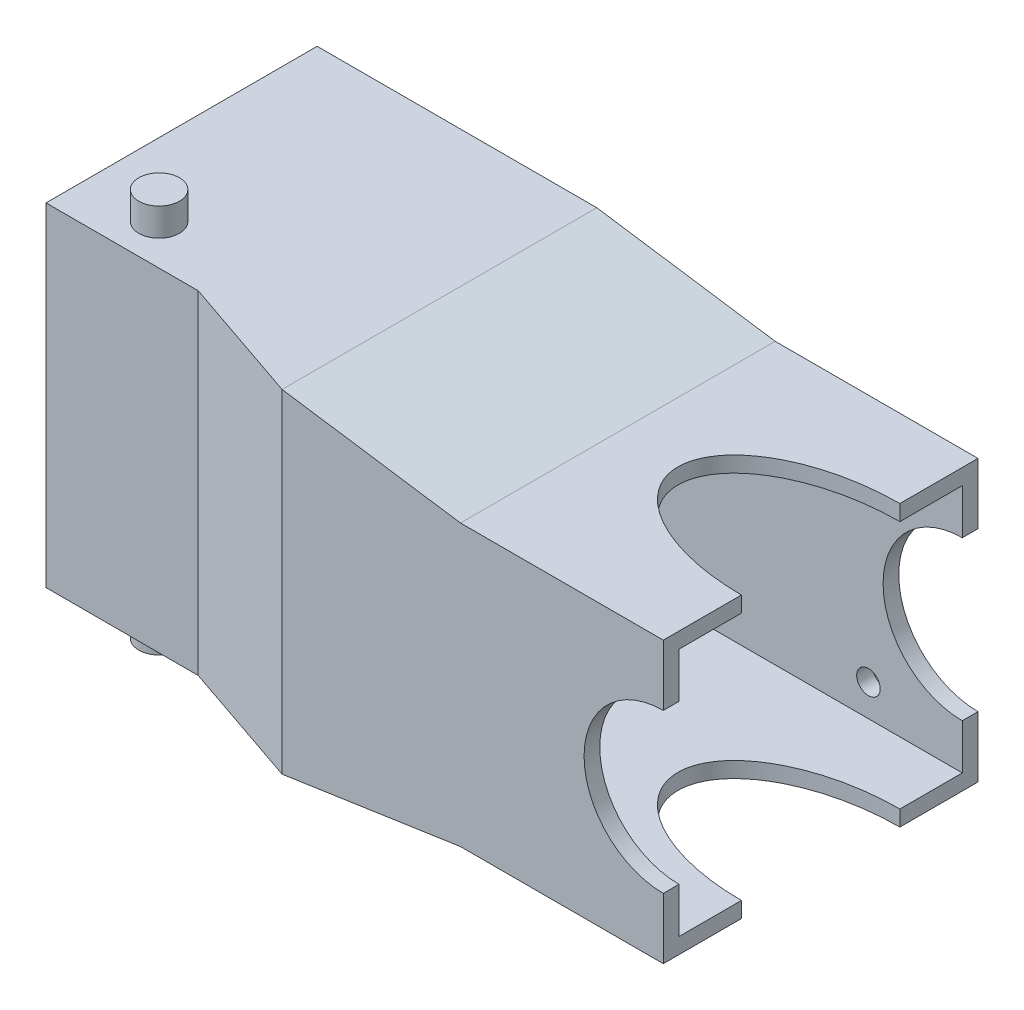
ISO-10303-21;
HEADER;
FILE_DESCRIPTION(('STEP AP214'),'2;1');
FILE_NAME('part.step','',(''),(''),'','','');
FILE_SCHEMA(('AUTOMOTIVE_DESIGN { 1 0 10303 214 1 1 1 1 }'));
ENDSEC;
DATA;
#1=APPLICATION_CONTEXT('core data for automotive mechanical design processes');
#2=APPLICATION_PROTOCOL_DEFINITION('international standard','automotive_design',2000,#1);
#3=PRODUCT_CONTEXT('',#1,'mechanical');
#4=PRODUCT('Part','Part','',(#3));
#5=PRODUCT_RELATED_PRODUCT_CATEGORY('part','',(#4));
#6=PRODUCT_DEFINITION_FORMATION('','',#4);
#7=PRODUCT_DEFINITION_CONTEXT('part definition',#1,'design');
#8=PRODUCT_DEFINITION('design','',#6,#7);
#9=PRODUCT_DEFINITION_SHAPE('','',#8);
#10=(LENGTH_UNIT() NAMED_UNIT(*) SI_UNIT(.MILLI.,.METRE.));
#11=(NAMED_UNIT(*) PLANE_ANGLE_UNIT() SI_UNIT($,.RADIAN.));
#12=(NAMED_UNIT(*) SI_UNIT($,.STERADIAN.) SOLID_ANGLE_UNIT());
#13=UNCERTAINTY_MEASURE_WITH_UNIT(LENGTH_MEASURE(1.E-05),#10,'distance_accuracy_value','');
#14=(GEOMETRIC_REPRESENTATION_CONTEXT(3) GLOBAL_UNCERTAINTY_ASSIGNED_CONTEXT((#13)) GLOBAL_UNIT_ASSIGNED_CONTEXT((#10,
#11,#12)) REPRESENTATION_CONTEXT('',''));
#15=CARTESIAN_POINT('',(0.,0.,0.));
#16=DIRECTION('',(0.,0.,1.));
#17=DIRECTION('',(1.,0.,0.));
#18=AXIS2_PLACEMENT_3D('',#15,#16,#17);
#19=CARTESIAN_POINT('',(28.42,17.435,-19.85));
#20=DIRECTION('',(0.,0.,-1.));
#21=DIRECTION('',(-1.,0.,0.));
#22=AXIS2_PLACEMENT_3D('',#19,#20,#21);
#23=PLANE('',#22);
#24=CARTESIAN_POINT('',(15.27,12.985,-19.85));
#25=DIRECTION('',(0.,0.,-1.));
#26=DIRECTION('',(-1.,0.,0.));
#27=AXIS2_PLACEMENT_3D('',#24,#25,#26);
#28=CIRCLE('',#27,1.65);
#29=CARTESIAN_POINT('',(13.62,12.985,-19.85));
#30=VERTEX_POINT('',#29);
#31=EDGE_CURVE('E285',#30,#30,#28,.T.);
#32=ORIENTED_EDGE('',*,*,#31,.T.);
#33=EDGE_LOOP('',(#32));
#34=FACE_BOUND('',#33,.T.);
#35=CARTESIAN_POINT('',(15.27,-12.985,-19.85));
#36=DIRECTION('',(0.,0.,-1.));
#37=DIRECTION('',(-1.,0.,0.));
#38=AXIS2_PLACEMENT_3D('',#35,#36,#37);
#39=CIRCLE('',#38,1.65);
#40=CARTESIAN_POINT('',(13.62,-12.985,-19.85));
#41=VERTEX_POINT('',#40);
#42=EDGE_CURVE('E289',#41,#41,#39,.T.);
#43=ORIENTED_EDGE('',*,*,#42,.T.);
#44=EDGE_LOOP('',(#43));
#45=FACE_BOUND('',#44,.T.);
#46=DIRECTION('',(0.,1.,0.));
#47=VECTOR('',#46,1.);
#48=CARTESIAN_POINT('',(-14.18,17.435,-19.85));
#49=LINE('',#48,#47);
#50=CARTESIAN_POINT('',(-14.18,-17.435,-19.85));
#51=VERTEX_POINT('',#50);
#52=CARTESIAN_POINT('',(-14.18,17.435,-19.85));
#53=VERTEX_POINT('',#52);
#54=EDGE_CURVE('E440',#51,#53,#49,.T.);
#55=ORIENTED_EDGE('',*,*,#54,.F.);
#56=DIRECTION('',(-1.,0.,0.));
#57=VECTOR('',#56,1.);
#58=CARTESIAN_POINT('',(28.42,-17.435,-19.85));
#59=LINE('',#58,#57);
#60=CARTESIAN_POINT('',(28.42,-17.435,-19.85));
#61=VERTEX_POINT('',#60);
#62=EDGE_CURVE('E365',#61,#51,#59,.T.);
#63=ORIENTED_EDGE('',*,*,#62,.F.);
#64=DIRECTION('',(0.,-1.,0.));
#65=VECTOR('',#64,1.);
#66=CARTESIAN_POINT('',(28.42,17.435,-19.85));
#67=LINE('',#66,#65);
#68=CARTESIAN_POINT('',(28.42,-11.1,-19.85));
#69=VERTEX_POINT('',#68);
#70=EDGE_CURVE('E439',#69,#61,#67,.T.);
#71=ORIENTED_EDGE('',*,*,#70,.F.);
#72=CARTESIAN_POINT('',(28.42,0.,-19.85));
#73=DIRECTION('',(0.,0.,-1.));
#74=DIRECTION('',(-1.,0.,0.));
#75=AXIS2_PLACEMENT_3D('',#72,#73,#74);
#76=CIRCLE('',#75,11.1);
#77=CARTESIAN_POINT('',(28.42,11.1,-19.85));
#78=VERTEX_POINT('',#77);
#79=EDGE_CURVE('E391',#69,#78,#76,.T.);
#80=ORIENTED_EDGE('',*,*,#79,.T.);
#81=CARTESIAN_POINT('',(28.42,17.435,-19.85));
#82=VERTEX_POINT('',#81);
#83=EDGE_CURVE('E428',#82,#78,#67,.T.);
#84=ORIENTED_EDGE('',*,*,#83,.F.);
#85=DIRECTION('',(-1.,0.,0.));
#86=VECTOR('',#85,1.);
#87=CARTESIAN_POINT('',(28.42,17.435,-19.85));
#88=LINE('',#87,#86);
#89=EDGE_CURVE('E420',#82,#53,#88,.T.);
#90=ORIENTED_EDGE('',*,*,#89,.T.);
#91=EDGE_LOOP('',(#55,#63,#71,#80,#84,#90));
#92=FACE_BOUND('',#91,.T.);
#93=ADVANCED_FACE('F34',(#34,#45,#92),#23,.F.);
#94=CARTESIAN_POINT('',(28.42,-19.635,-22.05));
#95=DIRECTION('',(0.,1.,0.));
#96=DIRECTION('',(0.,0.,1.));
#97=AXIS2_PLACEMENT_3D('',#94,#95,#96);
#98=PLANE('',#97);
#99=DIRECTION('',(0.,0.,1.));
#100=VECTOR('',#99,1.);
#101=CARTESIAN_POINT('',(0.,-19.635,-22.05));
#102=LINE('',#101,#100);
#103=CARTESIAN_POINT('',(0.,-19.635,-22.05));
#104=VERTEX_POINT('',#103);
#105=CARTESIAN_POINT('',(0.,-19.635,22.05));
#106=VERTEX_POINT('',#105);
#107=EDGE_CURVE('E276',#104,#106,#102,.T.);
#108=ORIENTED_EDGE('',*,*,#107,.F.);
#109=DIRECTION('',(-1.,0.,0.));
#110=VECTOR('',#109,1.);
#111=CARTESIAN_POINT('',(28.42,-19.635,-22.05));
#112=LINE('',#111,#110);
#113=CARTESIAN_POINT('',(28.42,-19.635,-22.05));
#114=VERTEX_POINT('',#113);
#115=EDGE_CURVE('E387',#114,#104,#112,.T.);
#116=ORIENTED_EDGE('',*,*,#115,.F.);
#117=DIRECTION('',(0.,0.,-1.));
#118=VECTOR('',#117,1.);
#119=CARTESIAN_POINT('',(28.42,-19.635,-22.05));
#120=LINE('',#119,#118);
#121=CARTESIAN_POINT('',(28.42,-19.635,-11.1));
#122=VERTEX_POINT('',#121);
#123=EDGE_CURVE('E363',#122,#114,#120,.T.);
#124=ORIENTED_EDGE('',*,*,#123,.F.);
#125=CARTESIAN_POINT('',(28.42,-19.635,0.));
#126=DIRECTION('',(0.,-1.,0.));
#127=DIRECTION('',(-1.,0.,0.));
#128=AXIS2_PLACEMENT_3D('',#125,#126,#127);
#129=ELLIPSE('',#128,20.,11.1);
#130=CARTESIAN_POINT('',(28.42,-19.635,11.1));
#131=VERTEX_POINT('',#130);
#132=EDGE_CURVE('E292',#131,#122,#129,.T.);
#133=ORIENTED_EDGE('',*,*,#132,.F.);
#134=CARTESIAN_POINT('',(28.42,-19.635,22.05));
#135=VERTEX_POINT('',#134);
#136=EDGE_CURVE('E371',#135,#131,#120,.T.);
#137=ORIENTED_EDGE('',*,*,#136,.F.);
#138=DIRECTION('',(-1.,0.,0.));
#139=VECTOR('',#138,1.);
#140=CARTESIAN_POINT('',(28.42,-19.635,22.05));
#141=LINE('',#140,#139);
#142=EDGE_CURVE('E355',#135,#106,#141,.T.);
#143=ORIENTED_EDGE('',*,*,#142,.T.);
#144=EDGE_LOOP('',(#108,#116,#124,#133,#137,#143));
#145=FACE_BOUND('',#144,.T.);
#146=ADVANCED_FACE('F315',(#145),#98,.F.);
#147=CARTESIAN_POINT('',(28.42,0.,0.));
#148=DIRECTION('',(1.,0.,0.));
#149=DIRECTION('',(0.,0.,-1.));
#150=AXIS2_PLACEMENT_3D('',#147,#148,#149);
#151=PLANE('',#150);
#152=DIRECTION('',(0.,-1.,0.));
#153=VECTOR('',#152,1.);
#154=CARTESIAN_POINT('',(28.42,30.365,11.1));
#155=LINE('',#154,#153);
#156=CARTESIAN_POINT('',(28.42,19.635,11.1));
#157=VERTEX_POINT('',#156);
#158=CARTESIAN_POINT('',(28.42,17.435,11.1));
#159=VERTEX_POINT('',#158);
#160=EDGE_CURVE('E528',#157,#159,#155,.T.);
#161=ORIENTED_EDGE('',*,*,#160,.F.);
#162=DIRECTION('',(0.,0.,1.));
#163=VECTOR('',#162,1.);
#164=CARTESIAN_POINT('',(28.42,19.635,-22.05));
#165=LINE('',#164,#163);
#166=CARTESIAN_POINT('',(28.42,19.635,22.05));
#167=VERTEX_POINT('',#166);
#168=EDGE_CURVE('E377',#157,#167,#165,.T.);
#169=ORIENTED_EDGE('',*,*,#168,.T.);
#170=DIRECTION('',(0.,-1.,0.));
#171=VECTOR('',#170,1.);
#172=CARTESIAN_POINT('',(28.42,-19.635,22.05));
#173=LINE('',#172,#171);
#174=CARTESIAN_POINT('',(28.42,11.1,22.05));
#175=VERTEX_POINT('',#174);
#176=EDGE_CURVE('E360',#167,#175,#173,.T.);
#177=ORIENTED_EDGE('',*,*,#176,.T.);
#178=DIRECTION('',(0.,0.,1.));
#179=VECTOR('',#178,1.);
#180=CARTESIAN_POINT('',(28.42,11.1,-27.95));
#181=LINE('',#180,#179);
#182=CARTESIAN_POINT('',(28.42,11.1,19.85));
#183=VERTEX_POINT('',#182);
#184=EDGE_CURVE('E539',#183,#175,#181,.T.);
#185=ORIENTED_EDGE('',*,*,#184,.F.);
#186=DIRECTION('',(0.,1.,0.));
#187=VECTOR('',#186,1.);
#188=CARTESIAN_POINT('',(28.42,17.435,19.85));
#189=LINE('',#188,#187);
#190=CARTESIAN_POINT('',(28.42,17.435,19.85));
#191=VERTEX_POINT('',#190);
#192=EDGE_CURVE('E545',#183,#191,#189,.T.);
#193=ORIENTED_EDGE('',*,*,#192,.T.);
#194=DIRECTION('',(0.,0.,-1.));
#195=VECTOR('',#194,1.);
#196=CARTESIAN_POINT('',(28.42,17.435,-19.85));
#197=LINE('',#196,#195);
#198=EDGE_CURVE('E419',#191,#159,#197,.T.);
#199=ORIENTED_EDGE('',*,*,#198,.T.);
#200=EDGE_LOOP('',(#161,#169,#177,#185,#193,#199));
#201=FACE_BOUND('',#200,.T.);
#202=ADVANCED_FACE('F328',(#201),#151,.T.);
#203=DIRECTION('',(0.,-1.,0.));
#204=VECTOR('',#203,1.);
#205=CARTESIAN_POINT('',(28.42,30.365,11.1));
#206=LINE('',#205,#204);
#207=CARTESIAN_POINT('',(28.42,-17.435,11.1));
#208=VERTEX_POINT('',#207);
#209=EDGE_CURVE('E520',#208,#131,#206,.T.);
#210=ORIENTED_EDGE('',*,*,#209,.F.);
#211=DIRECTION('',(0.,0.,1.));
#212=VECTOR('',#211,1.);
#213=CARTESIAN_POINT('',(28.42,-17.435,-19.85));
#214=LINE('',#213,#212);
#215=CARTESIAN_POINT('',(28.42,-17.435,19.85));
#216=VERTEX_POINT('',#215);
#217=EDGE_CURVE('E424',#208,#216,#214,.T.);
#218=ORIENTED_EDGE('',*,*,#217,.T.);
#219=CARTESIAN_POINT('',(28.42,-11.1,19.85));
#220=VERTEX_POINT('',#219);
#221=EDGE_CURVE('E415',#216,#220,#189,.T.);
#222=ORIENTED_EDGE('',*,*,#221,.T.);
#223=DIRECTION('',(0.,0.,1.));
#224=VECTOR('',#223,1.);
#225=CARTESIAN_POINT('',(28.42,-11.1,-27.95));
#226=LINE('',#225,#224);
#227=CARTESIAN_POINT('',(28.42,-11.1,22.05));
#228=VERTEX_POINT('',#227);
#229=EDGE_CURVE('E536',#228,#220,#226,.F.);
#230=ORIENTED_EDGE('',*,*,#229,.F.);
#231=EDGE_CURVE('E350',#228,#135,#173,.T.);
#232=ORIENTED_EDGE('',*,*,#231,.T.);
#233=ORIENTED_EDGE('',*,*,#136,.T.);
#234=EDGE_LOOP('',(#210,#218,#222,#230,#232,#233));
#235=FACE_BOUND('',#234,.T.);
#236=ADVANCED_FACE('F345',(#235),#151,.T.);
#237=DIRECTION('',(0.,-1.,0.));
#238=VECTOR('',#237,1.);
#239=CARTESIAN_POINT('',(28.42,30.365,-11.1));
#240=LINE('',#239,#238);
#241=CARTESIAN_POINT('',(28.42,17.435,-11.1));
#242=VERTEX_POINT('',#241);
#243=CARTESIAN_POINT('',(28.42,19.635,-11.1));
#244=VERTEX_POINT('',#243);
#245=EDGE_CURVE('E552',#242,#244,#240,.F.);
#246=ORIENTED_EDGE('',*,*,#245,.F.);
#247=EDGE_CURVE('E544',#242,#82,#197,.T.);
#248=ORIENTED_EDGE('',*,*,#247,.T.);
#249=ORIENTED_EDGE('',*,*,#83,.T.);
#250=CARTESIAN_POINT('',(28.42,11.1,-22.05));
#251=VERTEX_POINT('',#250);
#252=EDGE_CURVE('E535',#251,#78,#181,.T.);
#253=ORIENTED_EDGE('',*,*,#252,.F.);
#254=DIRECTION('',(0.,1.,0.));
#255=VECTOR('',#254,1.);
#256=CARTESIAN_POINT('',(28.42,-19.635,-22.05));
#257=LINE('',#256,#255);
#258=CARTESIAN_POINT('',(28.42,19.635,-22.05));
#259=VERTEX_POINT('',#258);
#260=EDGE_CURVE('E373',#251,#259,#257,.T.);
#261=ORIENTED_EDGE('',*,*,#260,.T.);
#262=EDGE_CURVE('E378',#259,#244,#165,.T.);
#263=ORIENTED_EDGE('',*,*,#262,.T.);
#264=EDGE_LOOP('',(#246,#248,#249,#253,#261,#263));
#265=FACE_BOUND('',#264,.T.);
#266=ADVANCED_FACE('F329',(#265),#151,.T.);
#267=CARTESIAN_POINT('',(28.42,-19.635,22.05));
#268=DIRECTION('',(0.,0.,-1.));
#269=DIRECTION('',(-1.,0.,0.));
#270=AXIS2_PLACEMENT_3D('',#267,#268,#269);
#271=PLANE('',#270);
#272=ORIENTED_EDGE('',*,*,#231,.F.);
#273=CARTESIAN_POINT('',(28.42,0.,22.05));
#274=DIRECTION('',(0.,0.,1.));
#275=DIRECTION('',(1.,0.,0.));
#276=AXIS2_PLACEMENT_3D('',#273,#274,#275);
#277=CIRCLE('',#276,11.1);
#278=EDGE_CURVE('E352',#175,#228,#277,.T.);
#279=ORIENTED_EDGE('',*,*,#278,.F.);
#280=ORIENTED_EDGE('',*,*,#176,.F.);
#281=DIRECTION('',(-1.,0.,0.));
#282=VECTOR('',#281,1.);
#283=CARTESIAN_POINT('',(28.42,19.635,22.05));
#284=LINE('',#283,#282);
#285=CARTESIAN_POINT('',(0.,19.635,22.05));
#286=VERTEX_POINT('',#285);
#287=EDGE_CURVE('E381',#167,#286,#284,.T.);
#288=ORIENTED_EDGE('',*,*,#287,.T.);
#289=DIRECTION('',(-0.989167317751702,0.146792429954352,0.));
#290=VECTOR('',#289,1.);
#291=CARTESIAN_POINT('',(0.,19.635,22.05));
#292=LINE('',#291,#290);
#293=CARTESIAN_POINT('',(-25.,23.345,22.05));
#294=VERTEX_POINT('',#293);
#295=EDGE_CURVE('E260',#286,#294,#292,.T.);
#296=ORIENTED_EDGE('',*,*,#295,.T.);
#297=DIRECTION('',(0.,1.,0.));
#298=VECTOR('',#297,1.);
#299=CARTESIAN_POINT('',(-25.,-19.635,22.05));
#300=LINE('',#299,#298);
#301=CARTESIAN_POINT('',(-25.,-23.345,22.05));
#302=VERTEX_POINT('',#301);
#303=EDGE_CURVE('E222',#302,#294,#300,.T.);
#304=ORIENTED_EDGE('',*,*,#303,.F.);
#305=DIRECTION('',(0.989167317751702,0.146792429954352,0.));
#306=VECTOR('',#305,1.);
#307=CARTESIAN_POINT('',(0.,-19.635,22.05));
#308=LINE('',#307,#306);
#309=EDGE_CURVE('E268',#302,#106,#308,.T.);
#310=ORIENTED_EDGE('',*,*,#309,.T.);
#311=ORIENTED_EDGE('',*,*,#142,.F.);
#312=EDGE_LOOP('',(#272,#279,#280,#288,#296,#304,#310,#311));
#313=FACE_BOUND('',#312,.T.);
#314=ADVANCED_FACE('F336',(#313),#271,.F.);
#315=CARTESIAN_POINT('',(28.42,-19.635,-22.05));
#316=DIRECTION('',(0.,0.,1.));
#317=DIRECTION('',(1.,0.,0.));
#318=AXIS2_PLACEMENT_3D('',#315,#316,#317);
#319=PLANE('',#318);
#320=DIRECTION('',(0.989167317751702,0.146792429954352,0.));
#321=VECTOR('',#320,1.);
#322=CARTESIAN_POINT('',(0.,-19.635,-22.05));
#323=LINE('',#322,#321);
#324=CARTESIAN_POINT('',(-25.,-23.345,-22.05));
#325=VERTEX_POINT('',#324);
#326=EDGE_CURVE('E271',#325,#104,#323,.T.);
#327=ORIENTED_EDGE('',*,*,#326,.F.);
#328=DIRECTION('',(-1.,0.,0.));
#329=VECTOR('',#328,1.);
#330=CARTESIAN_POINT('',(-25.,-23.345,-22.05));
#331=LINE('',#330,#329);
#332=CARTESIAN_POINT('',(-64.18,-23.345,-22.05));
#333=VERTEX_POINT('',#332);
#334=EDGE_CURVE('E244',#325,#333,#331,.T.);
#335=ORIENTED_EDGE('',*,*,#334,.T.);
#336=DIRECTION('',(0.,1.,0.));
#337=VECTOR('',#336,1.);
#338=CARTESIAN_POINT('',(-64.18,19.635,-22.05));
#339=LINE('',#338,#337);
#340=CARTESIAN_POINT('',(-64.18,23.345,-22.05));
#341=VERTEX_POINT('',#340);
#342=EDGE_CURVE('E280',#333,#341,#339,.T.);
#343=ORIENTED_EDGE('',*,*,#342,.T.);
#344=DIRECTION('',(1.,0.,0.));
#345=VECTOR('',#344,1.);
#346=CARTESIAN_POINT('',(-64.18,23.345,-22.05));
#347=LINE('',#346,#345);
#348=CARTESIAN_POINT('',(-25.,23.345,-22.05));
#349=VERTEX_POINT('',#348);
#350=EDGE_CURVE('E256',#341,#349,#347,.T.);
#351=ORIENTED_EDGE('',*,*,#350,.T.);
#352=DIRECTION('',(-0.989167317751702,0.146792429954352,0.));
#353=VECTOR('',#352,1.);
#354=CARTESIAN_POINT('',(0.,19.635,-22.05));
#355=LINE('',#354,#353);
#356=CARTESIAN_POINT('',(0.,19.635,-22.05));
#357=VERTEX_POINT('',#356);
#358=EDGE_CURVE('E261',#357,#349,#355,.T.);
#359=ORIENTED_EDGE('',*,*,#358,.F.);
#360=DIRECTION('',(-1.,0.,0.));
#361=VECTOR('',#360,1.);
#362=CARTESIAN_POINT('',(28.42,19.635,-22.05));
#363=LINE('',#362,#361);
#364=EDGE_CURVE('E384',#259,#357,#363,.T.);
#365=ORIENTED_EDGE('',*,*,#364,.F.);
#366=ORIENTED_EDGE('',*,*,#260,.F.);
#367=CARTESIAN_POINT('',(28.42,0.,-22.05));
#368=DIRECTION('',(0.,0.,1.));
#369=DIRECTION('',(1.,0.,0.));
#370=AXIS2_PLACEMENT_3D('',#367,#368,#369);
#371=CIRCLE('',#370,11.1);
#372=CARTESIAN_POINT('',(28.42,-11.1,-22.05));
#373=VERTEX_POINT('',#372);
#374=EDGE_CURVE('E538',#251,#373,#371,.T.);
#375=ORIENTED_EDGE('',*,*,#374,.T.);
#376=EDGE_CURVE('E374',#114,#373,#257,.T.);
#377=ORIENTED_EDGE('',*,*,#376,.F.);
#378=ORIENTED_EDGE('',*,*,#115,.T.);
#379=EDGE_LOOP('',(#327,#335,#343,#351,#359,#365,#366,#375,#377,#378));
#380=FACE_BOUND('',#379,.T.);
#381=CARTESIAN_POINT('',(15.27,-12.985,-22.05));
#382=DIRECTION('',(0.,0.,-1.));
#383=DIRECTION('',(-1.,0.,0.));
#384=AXIS2_PLACEMENT_3D('',#381,#382,#383);
#385=CIRCLE('',#384,1.65);
#386=CARTESIAN_POINT('',(13.62,-12.985,-22.05));
#387=VERTEX_POINT('',#386);
#388=EDGE_CURVE('E286',#387,#387,#385,.T.);
#389=ORIENTED_EDGE('',*,*,#388,.F.);
#390=EDGE_LOOP('',(#389));
#391=FACE_BOUND('',#390,.T.);
#392=CARTESIAN_POINT('',(15.27,12.985,-22.05));
#393=DIRECTION('',(0.,0.,-1.));
#394=DIRECTION('',(1.,0.,0.));
#395=AXIS2_PLACEMENT_3D('',#392,#393,#394);
#396=CIRCLE('',#395,1.65);
#397=CARTESIAN_POINT('',(16.92,12.985,-22.05));
#398=VERTEX_POINT('',#397);
#399=EDGE_CURVE('E282',#398,#398,#396,.T.);
#400=ORIENTED_EDGE('',*,*,#399,.F.);
#401=EDGE_LOOP('',(#400));
#402=FACE_BOUND('',#401,.T.);
#403=ADVANCED_FACE('F332',(#380,#391,#402),#319,.F.);
#404=CARTESIAN_POINT('',(28.42,19.635,-22.05));
#405=DIRECTION('',(0.,-1.,0.));
#406=DIRECTION('',(0.,0.,-1.));
#407=AXIS2_PLACEMENT_3D('',#404,#405,#406);
#408=PLANE('',#407);
#409=ORIENTED_EDGE('',*,*,#364,.T.);
#410=DIRECTION('',(0.,0.,1.));
#411=VECTOR('',#410,1.);
#412=CARTESIAN_POINT('',(0.,19.635,-22.05));
#413=LINE('',#412,#411);
#414=EDGE_CURVE('E264',#357,#286,#413,.T.);
#415=ORIENTED_EDGE('',*,*,#414,.T.);
#416=ORIENTED_EDGE('',*,*,#287,.F.);
#417=ORIENTED_EDGE('',*,*,#168,.F.);
#418=CARTESIAN_POINT('',(28.42,19.635,0.));
#419=DIRECTION('',(0.,-1.,0.));
#420=DIRECTION('',(-1.,0.,0.));
#421=AXIS2_PLACEMENT_3D('',#418,#419,#420);
#422=ELLIPSE('',#421,20.,11.1);
#423=EDGE_CURVE('E524',#157,#244,#422,.T.);
#424=ORIENTED_EDGE('',*,*,#423,.T.);
#425=ORIENTED_EDGE('',*,*,#262,.F.);
#426=EDGE_LOOP('',(#409,#415,#416,#417,#424,#425));
#427=FACE_BOUND('',#426,.T.);
#428=ADVANCED_FACE('F326',(#427),#408,.F.);
#429=DIRECTION('',(0.,-1.,0.));
#430=VECTOR('',#429,1.);
#431=CARTESIAN_POINT('',(28.42,30.365,-11.1));
#432=LINE('',#431,#430);
#433=CARTESIAN_POINT('',(28.42,-17.435,-11.1));
#434=VERTEX_POINT('',#433);
#435=EDGE_CURVE('E521',#122,#434,#432,.F.);
#436=ORIENTED_EDGE('',*,*,#435,.F.);
#437=ORIENTED_EDGE('',*,*,#123,.T.);
#438=ORIENTED_EDGE('',*,*,#376,.T.);
#439=EDGE_CURVE('E533',#69,#373,#226,.F.);
#440=ORIENTED_EDGE('',*,*,#439,.F.);
#441=ORIENTED_EDGE('',*,*,#70,.T.);
#442=EDGE_CURVE('E421',#61,#434,#214,.T.);
#443=ORIENTED_EDGE('',*,*,#442,.T.);
#444=EDGE_LOOP('',(#436,#437,#438,#440,#441,#443));
#445=FACE_BOUND('',#444,.T.);
#446=ADVANCED_FACE('F322',(#445),#151,.T.);
#447=CARTESIAN_POINT('',(28.42,17.435,19.85));
#448=DIRECTION('',(0.,0.,1.));
#449=DIRECTION('',(1.,0.,0.));
#450=AXIS2_PLACEMENT_3D('',#447,#448,#449);
#451=PLANE('',#450);
#452=ORIENTED_EDGE('',*,*,#192,.F.);
#453=CARTESIAN_POINT('',(28.42,0.,19.85));
#454=DIRECTION('',(0.,0.,1.));
#455=DIRECTION('',(1.,0.,0.));
#456=AXIS2_PLACEMENT_3D('',#453,#454,#455);
#457=CIRCLE('',#456,11.1);
#458=EDGE_CURVE('E542',#183,#220,#457,.T.);
#459=ORIENTED_EDGE('',*,*,#458,.T.);
#460=ORIENTED_EDGE('',*,*,#221,.F.);
#461=DIRECTION('',(-1.,0.,0.));
#462=VECTOR('',#461,1.);
#463=CARTESIAN_POINT('',(28.42,-17.435,19.85));
#464=LINE('',#463,#462);
#465=CARTESIAN_POINT('',(-25.,-17.435,19.85));
#466=VERTEX_POINT('',#465);
#467=EDGE_CURVE('E361',#216,#466,#464,.T.);
#468=ORIENTED_EDGE('',*,*,#467,.T.);
#469=DIRECTION('',(0.,-1.,0.));
#470=VECTOR('',#469,1.);
#471=CARTESIAN_POINT('',(-25.,17.435,19.85));
#472=LINE('',#471,#470);
#473=CARTESIAN_POINT('',(-25.,17.435,19.85));
#474=VERTEX_POINT('',#473);
#475=EDGE_CURVE('E241',#474,#466,#472,.T.);
#476=ORIENTED_EDGE('',*,*,#475,.F.);
#477=DIRECTION('',(-1.,0.,0.));
#478=VECTOR('',#477,1.);
#479=CARTESIAN_POINT('',(28.42,17.435,19.85));
#480=LINE('',#479,#478);
#481=EDGE_CURVE('E369',#191,#474,#480,.T.);
#482=ORIENTED_EDGE('',*,*,#481,.F.);
#483=EDGE_LOOP('',(#452,#459,#460,#468,#476,#482));
#484=FACE_BOUND('',#483,.T.);
#485=ADVANCED_FACE('F312',(#484),#451,.F.);
#486=CARTESIAN_POINT('',(28.42,-17.435,-19.85));
#487=DIRECTION('',(0.,-1.,0.));
#488=DIRECTION('',(0.,0.,-1.));
#489=AXIS2_PLACEMENT_3D('',#486,#487,#488);
#490=PLANE('',#489);
#491=DIRECTION('',(0.,0.,-1.));
#492=VECTOR('',#491,1.);
#493=CARTESIAN_POINT('',(-14.18,-17.435,-19.85));
#494=LINE('',#493,#492);
#495=CARTESIAN_POINT('',(-14.18,-17.435,13.75));
#496=VERTEX_POINT('',#495);
#497=EDGE_CURVE('E434',#496,#51,#494,.T.);
#498=ORIENTED_EDGE('',*,*,#497,.F.);
#499=DIRECTION('',(-1.,0.,0.));
#500=VECTOR('',#499,1.);
#501=CARTESIAN_POINT('',(28.42,-17.435,13.75));
#502=LINE('',#501,#500);
#503=CARTESIAN_POINT('',(-48.9330315672712,-17.435,13.75));
#504=VERTEX_POINT('',#503);
#505=EDGE_CURVE('E49',#496,#504,#502,.T.);
#506=ORIENTED_EDGE('',*,*,#505,.T.);
#507=CARTESIAN_POINT('',(-48.9330315672712,-17.435,63.75));
#508=DIRECTION('',(0.,-1.,0.));
#509=DIRECTION('',(0.,0.,-1.));
#510=AXIS2_PLACEMENT_3D('',#507,#508,#509);
#511=CIRCLE('',#510,50.);
#512=EDGE_CURVE('E42',#504,#466,#511,.T.);
#513=ORIENTED_EDGE('',*,*,#512,.T.);
#514=ORIENTED_EDGE('',*,*,#467,.F.);
#515=ORIENTED_EDGE('',*,*,#217,.F.);
#516=CARTESIAN_POINT('',(28.42,-17.435,0.));
#517=DIRECTION('',(0.,-1.,0.));
#518=DIRECTION('',(-1.,0.,0.));
#519=AXIS2_PLACEMENT_3D('',#516,#517,#518);
#520=ELLIPSE('',#519,20.,11.1);
#521=EDGE_CURVE('E523',#208,#434,#520,.T.);
#522=ORIENTED_EDGE('',*,*,#521,.T.);
#523=ORIENTED_EDGE('',*,*,#442,.F.);
#524=ORIENTED_EDGE('',*,*,#62,.T.);
#525=EDGE_LOOP('',(#498,#506,#513,#514,#515,#522,#523,#524));
#526=FACE_BOUND('',#525,.T.);
#527=ADVANCED_FACE('F308',(#526),#490,.F.);
#528=CARTESIAN_POINT('',(28.42,17.435,-19.85));
#529=DIRECTION('',(0.,1.,0.));
#530=DIRECTION('',(0.,0.,1.));
#531=AXIS2_PLACEMENT_3D('',#528,#529,#530);
#532=PLANE('',#531);
#533=ORIENTED_EDGE('',*,*,#481,.T.);
#534=CARTESIAN_POINT('',(-48.9330315672712,17.435,63.75));
#535=DIRECTION('',(0.,1.,0.));
#536=DIRECTION('',(0.,0.,1.));
#537=AXIS2_PLACEMENT_3D('',#534,#535,#536);
#538=CIRCLE('',#537,50.);
#539=CARTESIAN_POINT('',(-48.9330315672712,17.435,13.75));
#540=VERTEX_POINT('',#539);
#541=EDGE_CURVE('E11',#474,#540,#538,.T.);
#542=ORIENTED_EDGE('',*,*,#541,.T.);
#543=DIRECTION('',(1.,0.,0.));
#544=VECTOR('',#543,1.);
#545=CARTESIAN_POINT('',(28.42,17.435,13.75));
#546=LINE('',#545,#544);
#547=CARTESIAN_POINT('',(-14.18,17.435,13.75));
#548=VERTEX_POINT('',#547);
#549=EDGE_CURVE('E57',#540,#548,#546,.T.);
#550=ORIENTED_EDGE('',*,*,#549,.T.);
#551=DIRECTION('',(0.,0.,1.));
#552=VECTOR('',#551,1.);
#553=CARTESIAN_POINT('',(-14.18,17.435,-19.85));
#554=LINE('',#553,#552);
#555=EDGE_CURVE('E397',#53,#548,#554,.T.);
#556=ORIENTED_EDGE('',*,*,#555,.F.);
#557=ORIENTED_EDGE('',*,*,#89,.F.);
#558=ORIENTED_EDGE('',*,*,#247,.F.);
#559=CARTESIAN_POINT('',(28.42,17.435,0.));
#560=DIRECTION('',(0.,-1.,0.));
#561=DIRECTION('',(-1.,0.,0.));
#562=AXIS2_PLACEMENT_3D('',#559,#560,#561);
#563=ELLIPSE('',#562,20.,11.1);
#564=EDGE_CURVE('E394',#242,#159,#563,.F.);
#565=ORIENTED_EDGE('',*,*,#564,.T.);
#566=ORIENTED_EDGE('',*,*,#198,.F.);
#567=EDGE_LOOP('',(#533,#542,#550,#556,#557,#558,#565,#566));
#568=FACE_BOUND('',#567,.T.);
#569=ADVANCED_FACE('F311',(#568),#532,.F.);
#570=CARTESIAN_POINT('',(28.42,0.,-27.95));
#571=DIRECTION('',(0.,0.,1.));
#572=DIRECTION('',(1.,0.,0.));
#573=AXIS2_PLACEMENT_3D('',#570,#571,#572);
#574=CYLINDRICAL_SURFACE('',#573,11.1);
#575=ORIENTED_EDGE('',*,*,#252,.T.);
#576=ORIENTED_EDGE('',*,*,#79,.F.);
#577=ORIENTED_EDGE('',*,*,#439,.T.);
#578=ORIENTED_EDGE('',*,*,#374,.F.);
#579=EDGE_LOOP('',(#575,#576,#577,#578));
#580=FACE_BOUND('',#579,.T.);
#581=ADVANCED_FACE('F306',(#580),#574,.F.);
#582=ORIENTED_EDGE('',*,*,#184,.T.);
#583=ORIENTED_EDGE('',*,*,#278,.T.);
#584=ORIENTED_EDGE('',*,*,#229,.T.);
#585=ORIENTED_EDGE('',*,*,#458,.F.);
#586=EDGE_LOOP('',(#582,#583,#584,#585));
#587=FACE_BOUND('',#586,.T.);
#588=ADVANCED_FACE('F303',(#587),#574,.F.);
#589=CARTESIAN_POINT('',(28.42,30.365,0.));
#590=DIRECTION('',(0.,-1.,0.));
#591=DIRECTION('',(-1.,0.,0.));
#592=AXIS2_PLACEMENT_3D('',#589,#590,#591);
#593=ELLIPSE('',#592,20.,11.1);
#594=DIRECTION('',(0.,-1.,0.));
#595=VECTOR('',#594,1.);
#596=SURFACE_OF_LINEAR_EXTRUSION('',#593,#595);
#597=ORIENTED_EDGE('',*,*,#160,.T.);
#598=ORIENTED_EDGE('',*,*,#564,.F.);
#599=ORIENTED_EDGE('',*,*,#245,.T.);
#600=ORIENTED_EDGE('',*,*,#423,.F.);
#601=EDGE_LOOP('',(#597,#598,#599,#600));
#602=FACE_BOUND('',#601,.T.);
#603=ADVANCED_FACE('F300',(#602),#596,.F.);
#604=ORIENTED_EDGE('',*,*,#209,.T.);
#605=ORIENTED_EDGE('',*,*,#132,.T.);
#606=ORIENTED_EDGE('',*,*,#435,.T.);
#607=ORIENTED_EDGE('',*,*,#521,.F.);
#608=EDGE_LOOP('',(#604,#605,#606,#607));
#609=FACE_BOUND('',#608,.T.);
#610=ADVANCED_FACE('F295',(#609),#596,.F.);
#611=CARTESIAN_POINT('',(15.27,-12.985,-12.05));
#612=DIRECTION('',(0.,0.,-1.));
#613=DIRECTION('',(-1.,0.,0.));
#614=AXIS2_PLACEMENT_3D('',#611,#612,#613);
#615=CYLINDRICAL_SURFACE('',#614,1.65);
#616=ORIENTED_EDGE('',*,*,#388,.T.);
#617=EDGE_LOOP('',(#616));
#618=FACE_BOUND('',#617,.T.);
#619=ORIENTED_EDGE('',*,*,#42,.F.);
#620=EDGE_LOOP('',(#619));
#621=FACE_BOUND('',#620,.T.);
#622=ADVANCED_FACE('F299',(#618,#621),#615,.F.);
#623=CARTESIAN_POINT('',(15.27,12.985,-12.05));
#624=DIRECTION('',(0.,0.,-1.));
#625=DIRECTION('',(-1.,0.,0.));
#626=AXIS2_PLACEMENT_3D('',#623,#624,#625);
#627=CYLINDRICAL_SURFACE('',#626,1.65);
#628=ORIENTED_EDGE('',*,*,#399,.T.);
#629=EDGE_LOOP('',(#628));
#630=FACE_BOUND('',#629,.T.);
#631=ORIENTED_EDGE('',*,*,#31,.F.);
#632=EDGE_LOOP('',(#631));
#633=FACE_BOUND('',#632,.T.);
#634=ADVANCED_FACE('F574',(#630,#633),#627,.F.);
#635=CARTESIAN_POINT('',(-64.18,19.635,-19.85));
#636=DIRECTION('',(-1.,0.,0.));
#637=DIRECTION('',(0.,0.,1.));
#638=AXIS2_PLACEMENT_3D('',#635,#636,#637);
#639=PLANE('',#638);
#640=DIRECTION('',(0.,-1.,0.));
#641=VECTOR('',#640,1.);
#642=CARTESIAN_POINT('',(-64.18,21.145,-21.4975242004255));
#643=LINE('',#642,#641);
#644=CARTESIAN_POINT('',(-64.18,21.145,-21.4975242004255));
#645=VERTEX_POINT('',#644);
#646=CARTESIAN_POINT('',(-64.18,-21.145,-21.4975242004255));
#647=VERTEX_POINT('',#646);
#648=EDGE_CURVE('E234',#645,#647,#643,.T.);
#649=ORIENTED_EDGE('',*,*,#648,.F.);
#650=DIRECTION('',(0.,0.,-1.));
#651=VECTOR('',#650,1.);
#652=CARTESIAN_POINT('',(-64.18,21.145,-21.4975242004255));
#653=LINE('',#652,#651);
#654=CARTESIAN_POINT('',(-64.18,21.145,13.75));
#655=VERTEX_POINT('',#654);
#656=EDGE_CURVE('E458',#655,#645,#653,.T.);
#657=ORIENTED_EDGE('',*,*,#656,.F.);
#658=DIRECTION('',(0.,1.,0.));
#659=VECTOR('',#658,1.);
#660=CARTESIAN_POINT('',(-64.18,21.145,13.75));
#661=LINE('',#660,#659);
#662=CARTESIAN_POINT('',(-64.18,-21.145,13.75));
#663=VERTEX_POINT('',#662);
#664=EDGE_CURVE('E462',#663,#655,#661,.T.);
#665=ORIENTED_EDGE('',*,*,#664,.F.);
#666=DIRECTION('',(0.,0.,1.));
#667=VECTOR('',#666,1.);
#668=CARTESIAN_POINT('',(-64.18,-21.145,-21.4975242004255));
#669=LINE('',#668,#667);
#670=EDGE_CURVE('E465',#647,#663,#669,.T.);
#671=ORIENTED_EDGE('',*,*,#670,.F.);
#672=EDGE_LOOP('',(#649,#657,#665,#671));
#673=FACE_BOUND('',#672,.T.);
#674=ORIENTED_EDGE('',*,*,#342,.F.);
#675=DIRECTION('',(0.,0.,-1.));
#676=VECTOR('',#675,1.);
#677=CARTESIAN_POINT('',(-64.18,-23.345,-19.85));
#678=LINE('',#677,#676);
#679=CARTESIAN_POINT('',(-64.18,-23.345,15.95));
#680=VERTEX_POINT('',#679);
#681=EDGE_CURVE('E253',#680,#333,#678,.T.);
#682=ORIENTED_EDGE('',*,*,#681,.F.);
#683=DIRECTION('',(0.,1.,0.));
#684=VECTOR('',#683,1.);
#685=CARTESIAN_POINT('',(-64.18,23.345,15.95));
#686=LINE('',#685,#684);
#687=CARTESIAN_POINT('',(-64.18,23.345,15.95));
#688=VERTEX_POINT('',#687);
#689=EDGE_CURVE('E246',#680,#688,#686,.T.);
#690=ORIENTED_EDGE('',*,*,#689,.T.);
#691=DIRECTION('',(0.,0.,-1.));
#692=VECTOR('',#691,1.);
#693=CARTESIAN_POINT('',(-64.18,23.345,-19.85));
#694=LINE('',#693,#692);
#695=EDGE_CURVE('E239',#688,#341,#694,.T.);
#696=ORIENTED_EDGE('',*,*,#695,.T.);
#697=EDGE_LOOP('',(#674,#682,#690,#696));
#698=FACE_BOUND('',#697,.T.);
#699=ADVANCED_FACE('F571',(#673,#698),#639,.T.);
#700=CARTESIAN_POINT('',(0.,-19.635,-22.05));
#701=DIRECTION('',(0.146792429954352,-0.989167317751702,0.));
#702=DIRECTION('',(0.989167317751702,0.146792429954352,0.));
#703=AXIS2_PLACEMENT_3D('',#700,#701,#702);
#704=PLANE('',#703);
#705=ORIENTED_EDGE('',*,*,#309,.F.);
#706=DIRECTION('',(0.,0.,1.));
#707=VECTOR('',#706,1.);
#708=CARTESIAN_POINT('',(-25.,-23.345,-22.05));
#709=LINE('',#708,#707);
#710=EDGE_CURVE('E273',#325,#302,#709,.T.);
#711=ORIENTED_EDGE('',*,*,#710,.F.);
#712=ORIENTED_EDGE('',*,*,#326,.T.);
#713=ORIENTED_EDGE('',*,*,#107,.T.);
#714=EDGE_LOOP('',(#705,#711,#712,#713));
#715=FACE_BOUND('',#714,.T.);
#716=ADVANCED_FACE('F516',(#715),#704,.T.);
#717=CARTESIAN_POINT('',(0.,19.635,-22.05));
#718=DIRECTION('',(0.146792429954352,0.989167317751702,0.));
#719=DIRECTION('',(-0.989167317751702,0.146792429954352,0.));
#720=AXIS2_PLACEMENT_3D('',#717,#718,#719);
#721=PLANE('',#720);
#722=ORIENTED_EDGE('',*,*,#295,.F.);
#723=ORIENTED_EDGE('',*,*,#414,.F.);
#724=ORIENTED_EDGE('',*,*,#358,.T.);
#725=DIRECTION('',(0.,0.,1.));
#726=VECTOR('',#725,1.);
#727=CARTESIAN_POINT('',(-25.,23.345,-22.05));
#728=LINE('',#727,#726);
#729=EDGE_CURVE('E266',#349,#294,#728,.T.);
#730=ORIENTED_EDGE('',*,*,#729,.T.);
#731=EDGE_LOOP('',(#722,#723,#724,#730));
#732=FACE_BOUND('',#731,.T.);
#733=ADVANCED_FACE('F579',(#732),#721,.T.);
#734=CARTESIAN_POINT('',(-64.18,23.345,-19.85));
#735=DIRECTION('',(0.,1.,0.));
#736=DIRECTION('',(-1.,0.,0.));
#737=AXIS2_PLACEMENT_3D('',#734,#735,#736);
#738=PLANE('',#737);
#739=CARTESIAN_POINT('',(-53.98,23.345,10.3));
#740=DIRECTION('',(0.,1.,0.));
#741=DIRECTION('',(-1.,0.,0.));
#742=AXIS2_PLACEMENT_3D('',#739,#740,#741);
#743=CIRCLE('',#742,2.85);
#744=CARTESIAN_POINT('',(-56.83,23.345,10.3));
#745=VERTEX_POINT('',#744);
#746=EDGE_CURVE('E482',#745,#745,#743,.T.);
#747=ORIENTED_EDGE('',*,*,#746,.F.);
#748=EDGE_LOOP('',(#747));
#749=FACE_BOUND('',#748,.T.);
#750=ORIENTED_EDGE('',*,*,#350,.F.);
#751=ORIENTED_EDGE('',*,*,#695,.F.);
#752=DIRECTION('',(-1.,0.,0.));
#753=VECTOR('',#752,1.);
#754=CARTESIAN_POINT('',(-25.,23.345,15.95));
#755=LINE('',#754,#753);
#756=CARTESIAN_POINT('',(-42.8456648208737,23.345,15.95));
#757=VERTEX_POINT('',#756);
#758=EDGE_CURVE('E231',#757,#688,#755,.T.);
#759=ORIENTED_EDGE('',*,*,#758,.F.);
#760=DIRECTION('',(-0.946246706642623,0.,-0.323445776240764));
#761=VECTOR('',#760,1.);
#762=CARTESIAN_POINT('',(-25.,23.345,22.05));
#763=LINE('',#762,#761);
#764=EDGE_CURVE('E215',#294,#757,#763,.T.);
#765=ORIENTED_EDGE('',*,*,#764,.F.);
#766=ORIENTED_EDGE('',*,*,#729,.F.);
#767=EDGE_LOOP('',(#750,#751,#759,#765,#766));
#768=FACE_BOUND('',#767,.T.);
#769=ADVANCED_FACE('F237',(#749,#768),#738,.T.);
#770=CARTESIAN_POINT('',(-25.,-23.345,-19.85));
#771=DIRECTION('',(0.,-1.,0.));
#772=DIRECTION('',(1.,0.,0.));
#773=AXIS2_PLACEMENT_3D('',#770,#771,#772);
#774=PLANE('',#773);
#775=CARTESIAN_POINT('',(-53.98,-23.345,10.3));
#776=DIRECTION('',(0.,-1.,0.));
#777=DIRECTION('',(1.,0.,0.));
#778=AXIS2_PLACEMENT_3D('',#775,#776,#777);
#779=CIRCLE('',#778,2.85);
#780=CARTESIAN_POINT('',(-51.13,-23.345,10.3));
#781=VERTEX_POINT('',#780);
#782=EDGE_CURVE('E488',#781,#781,#779,.T.);
#783=ORIENTED_EDGE('',*,*,#782,.F.);
#784=EDGE_LOOP('',(#783));
#785=FACE_BOUND('',#784,.T.);
#786=ORIENTED_EDGE('',*,*,#334,.F.);
#787=ORIENTED_EDGE('',*,*,#710,.T.);
#788=DIRECTION('',(-0.946246706642623,0.,-0.323445776240764));
#789=VECTOR('',#788,1.);
#790=CARTESIAN_POINT('',(-25.,-23.345,22.05));
#791=LINE('',#790,#789);
#792=CARTESIAN_POINT('',(-42.8456648208737,-23.345,15.95));
#793=VERTEX_POINT('',#792);
#794=EDGE_CURVE('E226',#302,#793,#791,.T.);
#795=ORIENTED_EDGE('',*,*,#794,.T.);
#796=DIRECTION('',(-1.,0.,0.));
#797=VECTOR('',#796,1.);
#798=CARTESIAN_POINT('',(-25.,-23.345,15.95));
#799=LINE('',#798,#797);
#800=EDGE_CURVE('E233',#793,#680,#799,.T.);
#801=ORIENTED_EDGE('',*,*,#800,.T.);
#802=ORIENTED_EDGE('',*,*,#681,.T.);
#803=EDGE_LOOP('',(#786,#787,#795,#801,#802));
#804=FACE_BOUND('',#803,.T.);
#805=ADVANCED_FACE('F503',(#785,#804),#774,.T.);
#806=CARTESIAN_POINT('',(-25.,23.345,15.95));
#807=DIRECTION('',(0.,0.,1.));
#808=DIRECTION('',(0.,-1.,0.));
#809=AXIS2_PLACEMENT_3D('',#806,#807,#808);
#810=PLANE('',#809);
#811=DIRECTION('',(0.,-1.,0.));
#812=VECTOR('',#811,1.);
#813=CARTESIAN_POINT('',(-42.8456648208737,23.345,15.95));
#814=LINE('',#813,#812);
#815=EDGE_CURVE('E219',#757,#793,#814,.T.);
#816=ORIENTED_EDGE('',*,*,#815,.F.);
#817=ORIENTED_EDGE('',*,*,#758,.T.);
#818=ORIENTED_EDGE('',*,*,#689,.F.);
#819=ORIENTED_EDGE('',*,*,#800,.F.);
#820=EDGE_LOOP('',(#816,#817,#818,#819));
#821=FACE_BOUND('',#820,.T.);
#822=ADVANCED_FACE('F229',(#821),#810,.T.);
#823=CARTESIAN_POINT('',(-14.18,0.,0.));
#824=DIRECTION('',(-1.,0.,0.));
#825=DIRECTION('',(0.,0.,1.));
#826=AXIS2_PLACEMENT_3D('',#823,#824,#825);
#827=PLANE('',#826);
#828=ORIENTED_EDGE('',*,*,#497,.T.);
#829=ORIENTED_EDGE('',*,*,#54,.T.);
#830=ORIENTED_EDGE('',*,*,#555,.T.);
#831=DIRECTION('',(0.,1.,0.));
#832=VECTOR('',#831,1.);
#833=CARTESIAN_POINT('',(-14.18,21.145,13.75));
#834=LINE('',#833,#832);
#835=CARTESIAN_POINT('',(-14.18,21.145,13.75));
#836=VERTEX_POINT('',#835);
#837=EDGE_CURVE('E474',#548,#836,#834,.T.);
#838=ORIENTED_EDGE('',*,*,#837,.T.);
#839=DIRECTION('',(0.,0.,-1.));
#840=VECTOR('',#839,1.);
#841=CARTESIAN_POINT('',(-14.18,21.145,-21.4975242004255));
#842=LINE('',#841,#840);
#843=CARTESIAN_POINT('',(-14.18,21.145,-21.4975242004255));
#844=VERTEX_POINT('',#843);
#845=EDGE_CURVE('E453',#836,#844,#842,.T.);
#846=ORIENTED_EDGE('',*,*,#845,.T.);
#847=DIRECTION('',(0.,-1.,0.));
#848=VECTOR('',#847,1.);
#849=CARTESIAN_POINT('',(-14.18,21.145,-21.4975242004255));
#850=LINE('',#849,#848);
#851=CARTESIAN_POINT('',(-14.18,-21.145,-21.4975242004255));
#852=VERTEX_POINT('',#851);
#853=EDGE_CURVE('E461',#844,#852,#850,.T.);
#854=ORIENTED_EDGE('',*,*,#853,.T.);
#855=DIRECTION('',(0.,0.,1.));
#856=VECTOR('',#855,1.);
#857=CARTESIAN_POINT('',(-14.18,-21.145,-21.4975242004255));
#858=LINE('',#857,#856);
#859=CARTESIAN_POINT('',(-14.18,-21.145,13.75));
#860=VERTEX_POINT('',#859);
#861=EDGE_CURVE('E475',#852,#860,#858,.T.);
#862=ORIENTED_EDGE('',*,*,#861,.T.);
#863=EDGE_CURVE('E471',#860,#496,#834,.T.);
#864=ORIENTED_EDGE('',*,*,#863,.T.);
#865=EDGE_LOOP('',(#828,#829,#830,#838,#846,#854,#862,#864));
#866=FACE_BOUND('',#865,.T.);
#867=ADVANCED_FACE('F553',(#866),#827,.T.);
#868=CARTESIAN_POINT('',(-14.18,21.145,13.75));
#869=DIRECTION('',(0.,0.,1.));
#870=DIRECTION('',(0.,-1.,0.));
#871=AXIS2_PLACEMENT_3D('',#868,#869,#870);
#872=PLANE('',#871);
#873=DIRECTION('',(0.,-1.,0.));
#874=VECTOR('',#873,1.);
#875=CARTESIAN_POINT('',(-48.9330315672712,21.145,13.75));
#876=LINE('',#875,#874);
#877=EDGE_CURVE('E403',#540,#504,#876,.T.);
#878=ORIENTED_EDGE('',*,*,#877,.T.);
#879=ORIENTED_EDGE('',*,*,#505,.F.);
#880=ORIENTED_EDGE('',*,*,#863,.F.);
#881=DIRECTION('',(-1.,0.,0.));
#882=VECTOR('',#881,1.);
#883=CARTESIAN_POINT('',(-14.18,-21.145,13.75));
#884=LINE('',#883,#882);
#885=EDGE_CURVE('E452',#860,#663,#884,.T.);
#886=ORIENTED_EDGE('',*,*,#885,.T.);
#887=ORIENTED_EDGE('',*,*,#664,.T.);
#888=DIRECTION('',(-1.,0.,0.));
#889=VECTOR('',#888,1.);
#890=CARTESIAN_POINT('',(-14.18,21.145,13.75));
#891=LINE('',#890,#889);
#892=EDGE_CURVE('E455',#836,#655,#891,.T.);
#893=ORIENTED_EDGE('',*,*,#892,.F.);
#894=ORIENTED_EDGE('',*,*,#837,.F.);
#895=ORIENTED_EDGE('',*,*,#549,.F.);
#896=EDGE_LOOP('',(#878,#879,#880,#886,#887,#893,#894,#895));
#897=FACE_BOUND('',#896,.T.);
#898=ADVANCED_FACE('F555',(#897),#872,.F.);
#899=CARTESIAN_POINT('',(-14.18,21.145,-21.4975242004255));
#900=DIRECTION('',(0.,0.,-1.));
#901=DIRECTION('',(0.,1.,0.));
#902=AXIS2_PLACEMENT_3D('',#899,#900,#901);
#903=PLANE('',#902);
#904=ORIENTED_EDGE('',*,*,#648,.T.);
#905=DIRECTION('',(-1.,0.,0.));
#906=VECTOR('',#905,1.);
#907=CARTESIAN_POINT('',(-14.18,-21.145,-21.4975242004255));
#908=LINE('',#907,#906);
#909=EDGE_CURVE('E449',#852,#647,#908,.T.);
#910=ORIENTED_EDGE('',*,*,#909,.F.);
#911=ORIENTED_EDGE('',*,*,#853,.F.);
#912=DIRECTION('',(-1.,0.,0.));
#913=VECTOR('',#912,1.);
#914=CARTESIAN_POINT('',(-14.18,21.145,-21.4975242004255));
#915=LINE('',#914,#913);
#916=EDGE_CURVE('E448',#844,#645,#915,.T.);
#917=ORIENTED_EDGE('',*,*,#916,.T.);
#918=EDGE_LOOP('',(#904,#910,#911,#917));
#919=FACE_BOUND('',#918,.T.);
#920=ADVANCED_FACE('F564',(#919),#903,.F.);
#921=CARTESIAN_POINT('',(-14.18,21.145,-21.4975242004255));
#922=DIRECTION('',(0.,1.,0.));
#923=DIRECTION('',(0.,0.,1.));
#924=AXIS2_PLACEMENT_3D('',#921,#922,#923);
#925=PLANE('',#924);
#926=ORIENTED_EDGE('',*,*,#656,.T.);
#927=ORIENTED_EDGE('',*,*,#916,.F.);
#928=ORIENTED_EDGE('',*,*,#845,.F.);
#929=ORIENTED_EDGE('',*,*,#892,.T.);
#930=EDGE_LOOP('',(#926,#927,#928,#929));
#931=FACE_BOUND('',#930,.T.);
#932=ADVANCED_FACE('F560',(#931),#925,.F.);
#933=CARTESIAN_POINT('',(-14.18,-21.145,-21.4975242004255));
#934=DIRECTION('',(0.,-1.,0.));
#935=DIRECTION('',(0.,0.,-1.));
#936=AXIS2_PLACEMENT_3D('',#933,#934,#935);
#937=PLANE('',#936);
#938=ORIENTED_EDGE('',*,*,#670,.T.);
#939=ORIENTED_EDGE('',*,*,#885,.F.);
#940=ORIENTED_EDGE('',*,*,#861,.F.);
#941=ORIENTED_EDGE('',*,*,#909,.T.);
#942=EDGE_LOOP('',(#938,#939,#940,#941));
#943=FACE_BOUND('',#942,.T.);
#944=ADVANCED_FACE('F568',(#943),#937,.F.);
#945=CARTESIAN_POINT('',(-25.,23.345,22.05));
#946=DIRECTION('',(-0.323445776240764,0.,0.946246706642623));
#947=DIRECTION('',(0.946246706642623,0.,0.323445776240764));
#948=AXIS2_PLACEMENT_3D('',#945,#946,#947);
#949=PLANE('',#948);
#950=ORIENTED_EDGE('',*,*,#794,.F.);
#951=ORIENTED_EDGE('',*,*,#303,.T.);
#952=ORIENTED_EDGE('',*,*,#764,.T.);
#953=ORIENTED_EDGE('',*,*,#815,.T.);
#954=EDGE_LOOP('',(#950,#951,#952,#953));
#955=FACE_BOUND('',#954,.T.);
#956=ADVANCED_FACE('F218',(#955),#949,.T.);
#957=CARTESIAN_POINT('',(-48.9330315672712,0.,63.75));
#958=DIRECTION('',(0.,-1.,0.));
#959=DIRECTION('',(0.,0.,-1.));
#960=AXIS2_PLACEMENT_3D('',#957,#958,#959);
#961=CYLINDRICAL_SURFACE('',#960,50.);
#962=ORIENTED_EDGE('',*,*,#541,.F.);
#963=ORIENTED_EDGE('',*,*,#475,.T.);
#964=ORIENTED_EDGE('',*,*,#512,.F.);
#965=ORIENTED_EDGE('',*,*,#877,.F.);
#966=EDGE_LOOP('',(#962,#963,#964,#965));
#967=FACE_BOUND('',#966,.T.);
#968=ADVANCED_FACE('F36',(#967),#961,.T.);
#969=CARTESIAN_POINT('',(-53.98,27.245,10.3));
#970=DIRECTION('',(0.,-1.,0.));
#971=DIRECTION('',(1.,0.,0.));
#972=AXIS2_PLACEMENT_3D('',#969,#970,#971);
#973=CYLINDRICAL_SURFACE('',#972,2.85);
#974=CARTESIAN_POINT('',(-53.98,27.245,10.3));
#975=DIRECTION('',(0.,1.,0.));
#976=DIRECTION('',(-1.,0.,0.));
#977=AXIS2_PLACEMENT_3D('',#974,#975,#976);
#978=CIRCLE('',#977,2.85);
#979=CARTESIAN_POINT('',(-56.83,27.245,10.3));
#980=VERTEX_POINT('',#979);
#981=EDGE_CURVE('E480',#980,#980,#978,.T.);
#982=ORIENTED_EDGE('',*,*,#981,.F.);
#983=EDGE_LOOP('',(#982));
#984=FACE_BOUND('',#983,.T.);
#985=ORIENTED_EDGE('',*,*,#746,.T.);
#986=EDGE_LOOP('',(#985));
#987=FACE_BOUND('',#986,.T.);
#988=ADVANCED_FACE('F693',(#984,#987),#973,.T.);
#989=CARTESIAN_POINT('',(-53.98,27.245,10.3));
#990=DIRECTION('',(0.,1.,0.));
#991=DIRECTION('',(-1.,0.,0.));
#992=AXIS2_PLACEMENT_3D('',#989,#990,#991);
#993=PLANE('',#992);
#994=ORIENTED_EDGE('',*,*,#981,.T.);
#995=EDGE_LOOP('',(#994));
#996=FACE_BOUND('',#995,.T.);
#997=ADVANCED_FACE('F499',(#996),#993,.T.);
#998=CARTESIAN_POINT('',(-53.98,-27.245,10.3));
#999=DIRECTION('',(0.,1.,0.));
#1000=DIRECTION('',(-1.,0.,0.));
#1001=AXIS2_PLACEMENT_3D('',#998,#999,#1000);
#1002=CYLINDRICAL_SURFACE('',#1001,2.85);
#1003=CARTESIAN_POINT('',(-53.98,-27.245,10.3));
#1004=DIRECTION('',(0.,-1.,0.));
#1005=DIRECTION('',(1.,0.,0.));
#1006=AXIS2_PLACEMENT_3D('',#1003,#1004,#1005);
#1007=CIRCLE('',#1006,2.85);
#1008=CARTESIAN_POINT('',(-51.13,-27.245,10.3));
#1009=VERTEX_POINT('',#1008);
#1010=EDGE_CURVE('E485',#1009,#1009,#1007,.T.);
#1011=ORIENTED_EDGE('',*,*,#1010,.F.);
#1012=EDGE_LOOP('',(#1011));
#1013=FACE_BOUND('',#1012,.T.);
#1014=ORIENTED_EDGE('',*,*,#782,.T.);
#1015=EDGE_LOOP('',(#1014));
#1016=FACE_BOUND('',#1015,.T.);
#1017=ADVANCED_FACE('F496',(#1013,#1016),#1002,.T.);
#1018=CARTESIAN_POINT('',(-53.98,-27.245,10.3));
#1019=DIRECTION('',(0.,-1.,0.));
#1020=DIRECTION('',(1.,0.,0.));
#1021=AXIS2_PLACEMENT_3D('',#1018,#1019,#1020);
#1022=PLANE('',#1021);
#1023=ORIENTED_EDGE('',*,*,#1010,.T.);
#1024=EDGE_LOOP('',(#1023));
#1025=FACE_BOUND('',#1024,.T.);
#1026=ADVANCED_FACE('F494',(#1025),#1022,.T.);
#1027=CLOSED_SHELL('',(#93,#146,#202,#236,#266,#314,#403,#428,#446,#485,#527,#569,#581,#588,
#603,#610,#622,#634,#699,#716,#733,#769,#805,#822,#867,#898,#920,#932,#944,#956,#968,#988,#997,
#1017,#1026));
#1028=MANIFOLD_SOLID_BREP('B2',#1027);
#1029=ADVANCED_BREP_SHAPE_REPRESENTATION('',(#18,#1028),#14);
#1030=SHAPE_DEFINITION_REPRESENTATION(#9,#1029);
ENDSEC;
END-ISO-10303-21;
